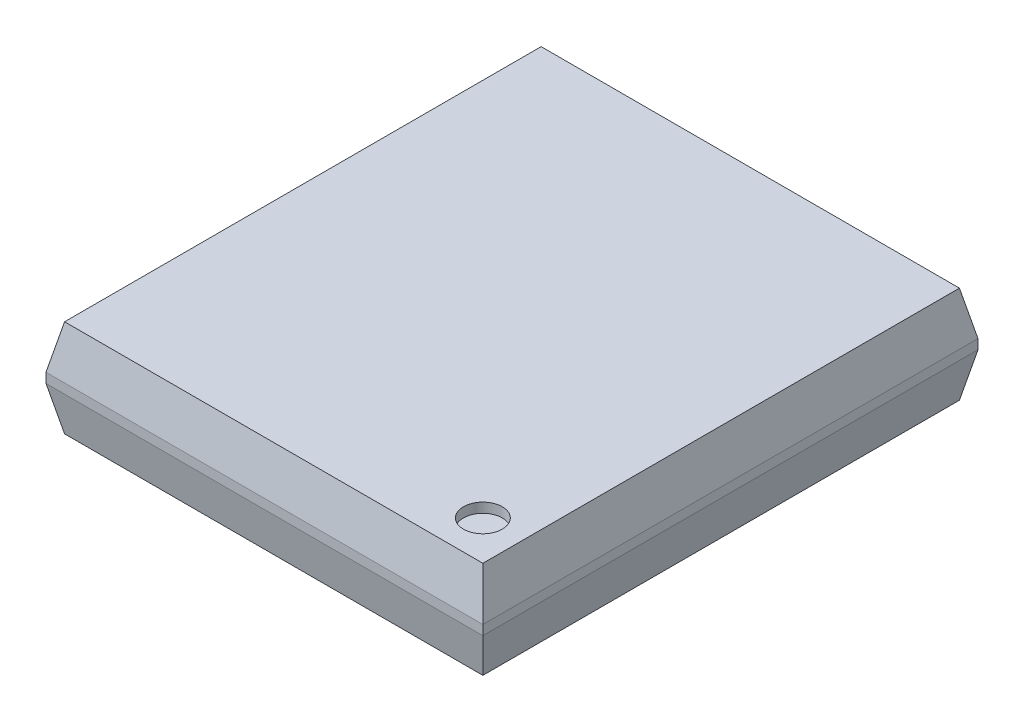
ISO-10303-21;
HEADER;
FILE_DESCRIPTION(('STEP AP214'),'2;1');
FILE_NAME('part.step','',(''),(''),'','','');
FILE_SCHEMA(('AUTOMOTIVE_DESIGN { 1 0 10303 214 1 1 1 1 }'));
ENDSEC;
DATA;
#1=APPLICATION_CONTEXT('core data for automotive mechanical design processes');
#2=APPLICATION_PROTOCOL_DEFINITION('international standard','automotive_design',2000,#1);
#3=PRODUCT_CONTEXT('',#1,'mechanical');
#4=PRODUCT('Part','Part','',(#3));
#5=PRODUCT_RELATED_PRODUCT_CATEGORY('part','',(#4));
#6=PRODUCT_DEFINITION_FORMATION('','',#4);
#7=PRODUCT_DEFINITION_CONTEXT('part definition',#1,'design');
#8=PRODUCT_DEFINITION('design','',#6,#7);
#9=PRODUCT_DEFINITION_SHAPE('','',#8);
#10=(LENGTH_UNIT() NAMED_UNIT(*) SI_UNIT(.MILLI.,.METRE.));
#11=(NAMED_UNIT(*) PLANE_ANGLE_UNIT() SI_UNIT($,.RADIAN.));
#12=(NAMED_UNIT(*) SI_UNIT($,.STERADIAN.) SOLID_ANGLE_UNIT());
#13=UNCERTAINTY_MEASURE_WITH_UNIT(LENGTH_MEASURE(1.E-05),#10,'distance_accuracy_value','');
#14=(GEOMETRIC_REPRESENTATION_CONTEXT(3) GLOBAL_UNCERTAINTY_ASSIGNED_CONTEXT((#13)) GLOBAL_UNIT_ASSIGNED_CONTEXT((#10,
#11,#12)) REPRESENTATION_CONTEXT('',''));
#15=CARTESIAN_POINT('',(0.,0.,0.));
#16=DIRECTION('',(0.,0.,1.));
#17=DIRECTION('',(1.,0.,0.));
#18=AXIS2_PLACEMENT_3D('',#15,#16,#17);
#19=CARTESIAN_POINT('',(1.75,0.4,2.05));
#20=DIRECTION('',(0.,1.,0.));
#21=DIRECTION('',(0.,0.,1.));
#22=AXIS2_PLACEMENT_3D('',#19,#20,#21);
#23=PLANE('',#22);
#24=CARTESIAN_POINT('',(1.75,0.4,2.05));
#25=DIRECTION('',(0.,1.,0.));
#26=DIRECTION('',(0.,0.,1.));
#27=AXIS2_PLACEMENT_3D('',#24,#25,#26);
#28=CIRCLE('',#27,0.2);
#29=CARTESIAN_POINT('',(1.75,0.4,2.25));
#30=VERTEX_POINT('',#29);
#31=EDGE_CURVE('E20',#30,#30,#28,.T.);
#32=ORIENTED_EDGE('',*,*,#31,.T.);
#33=EDGE_LOOP('',(#32));
#34=FACE_BOUND('',#33,.T.);
#35=ADVANCED_FACE('F17',(#34),#23,.T.);
#36=CARTESIAN_POINT('',(1.75,0.4,2.05));
#37=DIRECTION('',(0.,1.,0.));
#38=DIRECTION('',(0.,0.,1.));
#39=AXIS2_PLACEMENT_3D('',#36,#37,#38);
#40=CYLINDRICAL_SURFACE('',#39,0.2);
#41=ORIENTED_EDGE('',*,*,#31,.F.);
#42=EDGE_LOOP('',(#41));
#43=FACE_BOUND('',#42,.T.);
#44=CARTESIAN_POINT('',(1.75,0.5,2.05));
#45=DIRECTION('',(0.,1.,0.));
#46=DIRECTION('',(0.,0.,1.));
#47=AXIS2_PLACEMENT_3D('',#44,#45,#46);
#48=CIRCLE('',#47,0.2);
#49=CARTESIAN_POINT('',(1.75,0.5,2.25));
#50=VERTEX_POINT('',#49);
#51=EDGE_CURVE('E91',#50,#50,#48,.F.);
#52=ORIENTED_EDGE('',*,*,#51,.F.);
#53=EDGE_LOOP('',(#52));
#54=FACE_BOUND('',#53,.T.);
#55=ADVANCED_FACE('F113',(#43,#54),#40,.F.);
#56=CARTESIAN_POINT('',(-2.25,0.5,2.55));
#57=DIRECTION('',(0.,1.,0.));
#58=DIRECTION('',(0.,0.,1.));
#59=AXIS2_PLACEMENT_3D('',#56,#57,#58);
#60=PLANE('',#59);
#61=ORIENTED_EDGE('',*,*,#51,.T.);
#62=EDGE_LOOP('',(#61));
#63=FACE_BOUND('',#62,.T.);
#64=DIRECTION('',(1.,0.,0.));
#65=VECTOR('',#64,1.);
#66=CARTESIAN_POINT('',(-2.25,0.5,-2.454349547248));
#67=LINE('',#66,#65);
#68=CARTESIAN_POINT('',(2.154349547248,0.5,-2.454349547248));
#69=VERTEX_POINT('',#68);
#70=CARTESIAN_POINT('',(-2.154349547248,0.5,-2.454349547248));
#71=VERTEX_POINT('',#70);
#72=EDGE_CURVE('E82',#69,#71,#67,.F.);
#73=ORIENTED_EDGE('',*,*,#72,.T.);
#74=DIRECTION('',(0.,0.,1.));
#75=VECTOR('',#74,1.);
#76=CARTESIAN_POINT('',(-2.154349547248,0.5,2.55));
#77=LINE('',#76,#75);
#78=CARTESIAN_POINT('',(-2.154349547248,0.5,2.454349547248));
#79=VERTEX_POINT('',#78);
#80=EDGE_CURVE('E79',#71,#79,#77,.T.);
#81=ORIENTED_EDGE('',*,*,#80,.T.);
#82=DIRECTION('',(1.,0.,0.));
#83=VECTOR('',#82,1.);
#84=CARTESIAN_POINT('',(-2.25,0.5,2.454349547248));
#85=LINE('',#84,#83);
#86=CARTESIAN_POINT('',(2.154349547248,0.5,2.454349547248));
#87=VERTEX_POINT('',#86);
#88=EDGE_CURVE('E301',#79,#87,#85,.T.);
#89=ORIENTED_EDGE('',*,*,#88,.T.);
#90=DIRECTION('',(0.,0.,1.));
#91=VECTOR('',#90,1.);
#92=CARTESIAN_POINT('',(2.154349547248,0.5,2.55));
#93=LINE('',#92,#91);
#94=EDGE_CURVE('E85',#87,#69,#93,.F.);
#95=ORIENTED_EDGE('',*,*,#94,.T.);
#96=EDGE_LOOP('',(#73,#81,#89,#95));
#97=FACE_BOUND('',#96,.T.);
#98=ADVANCED_FACE('F83',(#63,#97),#60,.T.);
#99=CARTESIAN_POINT('',(-2.25,0.5,-2.454349547248));
#100=DIRECTION('',(0.,-0.20791169081795,0.978147600733765));
#101=DIRECTION('',(0.,-0.978147600733765,-0.20791169081795));
#102=AXIS2_PLACEMENT_3D('',#99,#100,#101);
#103=PLANE('',#102);
#104=DIRECTION('',(0.203558594952925,0.95766789485774,0.203558594953729));
#105=VECTOR('',#104,1.);
#106=CARTESIAN_POINT('',(-2.24999999999962,0.0499999999999094,-2.55));
#107=LINE('',#106,#105);
#108=CARTESIAN_POINT('',(-2.24999999999991,0.0499999999999296,-2.54999999999981));
#109=VERTEX_POINT('',#108);
#110=EDGE_CURVE('E90',#109,#71,#107,.T.);
#111=ORIENTED_EDGE('',*,*,#110,.T.);
#112=ORIENTED_EDGE('',*,*,#72,.F.);
#113=DIRECTION('',(0.203558594952925,-0.95766789485774,-0.203558594953729));
#114=VECTOR('',#113,1.);
#115=CARTESIAN_POINT('',(2.154349547248,0.5,-2.454349547248));
#116=LINE('',#115,#114);
#117=CARTESIAN_POINT('',(2.24999999999995,0.0499999999999397,-2.54999999999981));
#118=VERTEX_POINT('',#117);
#119=EDGE_CURVE('E324',#69,#118,#116,.T.);
#120=ORIENTED_EDGE('',*,*,#119,.T.);
#121=DIRECTION('',(-1.,0.,0.));
#122=VECTOR('',#121,1.);
#123=CARTESIAN_POINT('',(-2.25,0.04999999999999,-2.55));
#124=LINE('',#123,#122);
#125=EDGE_CURVE('E102',#109,#118,#124,.F.);
#126=ORIENTED_EDGE('',*,*,#125,.F.);
#127=EDGE_LOOP('',(#111,#112,#120,#126));
#128=FACE_BOUND('',#127,.T.);
#129=ADVANCED_FACE('F101',(#128),#103,.F.);
#130=CARTESIAN_POINT('',(-2.154349547248,0.5,2.55));
#131=DIRECTION('',(0.978147600733765,-0.20791169081795,0.));
#132=DIRECTION('',(0.20791169081795,0.978147600733765,0.));
#133=AXIS2_PLACEMENT_3D('',#130,#131,#132);
#134=PLANE('',#133);
#135=DIRECTION('',(0.203558594953731,0.957667894857739,-0.203558594952925));
#136=VECTOR('',#135,1.);
#137=CARTESIAN_POINT('',(-2.25,0.0499999999999094,2.54999999999962));
#138=LINE('',#137,#136);
#139=CARTESIAN_POINT('',(-2.24999999999981,0.0499999999999296,2.5499999999999));
#140=VERTEX_POINT('',#139);
#141=EDGE_CURVE('E98',#140,#79,#138,.T.);
#142=ORIENTED_EDGE('',*,*,#141,.T.);
#143=ORIENTED_EDGE('',*,*,#80,.F.);
#144=ORIENTED_EDGE('',*,*,#110,.F.);
#145=DIRECTION('',(0.,0.,1.));
#146=VECTOR('',#145,1.);
#147=CARTESIAN_POINT('',(-2.25,0.04999999999999,-2.55));
#148=LINE('',#147,#146);
#149=EDGE_CURVE('E309',#140,#109,#148,.F.);
#150=ORIENTED_EDGE('',*,*,#149,.F.);
#151=EDGE_LOOP('',(#142,#143,#144,#150));
#152=FACE_BOUND('',#151,.T.);
#153=ADVANCED_FACE('F95',(#152),#134,.F.);
#154=CARTESIAN_POINT('',(-2.25,0.5,2.454349547248));
#155=DIRECTION('',(0.,-0.20791169081795,-0.978147600733765));
#156=DIRECTION('',(0.,0.978147600733765,-0.20791169081795));
#157=AXIS2_PLACEMENT_3D('',#154,#155,#156);
#158=PLANE('',#157);
#159=ORIENTED_EDGE('',*,*,#141,.F.);
#160=DIRECTION('',(1.,0.,0.));
#161=VECTOR('',#160,1.);
#162=CARTESIAN_POINT('',(-2.25,0.04999999999999,2.55));
#163=LINE('',#162,#161);
#164=CARTESIAN_POINT('',(2.24999999999991,0.0499999999999296,2.54999999999981));
#165=VERTEX_POINT('',#164);
#166=EDGE_CURVE('E299',#165,#140,#163,.F.);
#167=ORIENTED_EDGE('',*,*,#166,.F.);
#168=DIRECTION('',(-0.203558594952925,0.957667894857739,-0.20355859495373));
#169=VECTOR('',#168,1.);
#170=CARTESIAN_POINT('',(2.24999999999962,0.0499999999999094,2.55));
#171=LINE('',#170,#169);
#172=EDGE_CURVE('E327',#165,#87,#171,.T.);
#173=ORIENTED_EDGE('',*,*,#172,.T.);
#174=ORIENTED_EDGE('',*,*,#88,.F.);
#175=EDGE_LOOP('',(#159,#167,#173,#174));
#176=FACE_BOUND('',#175,.T.);
#177=ADVANCED_FACE('F164',(#176),#158,.F.);
#178=CARTESIAN_POINT('',(2.154349547248,0.5,2.55));
#179=DIRECTION('',(-0.978147600733765,-0.20791169081795,0.));
#180=DIRECTION('',(0.20791169081795,-0.978147600733765,0.));
#181=AXIS2_PLACEMENT_3D('',#178,#179,#180);
#182=PLANE('',#181);
#183=ORIENTED_EDGE('',*,*,#119,.F.);
#184=ORIENTED_EDGE('',*,*,#94,.F.);
#185=ORIENTED_EDGE('',*,*,#172,.F.);
#186=DIRECTION('',(0.,0.,-1.));
#187=VECTOR('',#186,1.);
#188=CARTESIAN_POINT('',(2.25,0.04999999999999,-2.55));
#189=LINE('',#188,#187);
#190=EDGE_CURVE('E318',#118,#165,#189,.F.);
#191=ORIENTED_EDGE('',*,*,#190,.F.);
#192=EDGE_LOOP('',(#183,#184,#185,#191));
#193=FACE_BOUND('',#192,.T.);
#194=ADVANCED_FACE('F160',(#193),#182,.F.);
#195=CARTESIAN_POINT('',(-2.25,-0.5,-2.55));
#196=DIRECTION('',(0.,0.,-1.));
#197=DIRECTION('',(-1.,0.,0.));
#198=AXIS2_PLACEMENT_3D('',#195,#196,#197);
#199=PLANE('',#198);
#200=DIRECTION('',(0.,1.,0.));
#201=VECTOR('',#200,1.);
#202=CARTESIAN_POINT('',(2.25,-0.5,-2.55));
#203=LINE('',#202,#201);
#204=CARTESIAN_POINT('',(2.25,-0.04999999999999,-2.55));
#205=VERTEX_POINT('',#204);
#206=EDGE_CURVE('E315',#205,#118,#203,.T.);
#207=ORIENTED_EDGE('',*,*,#206,.F.);
#208=DIRECTION('',(1.,0.,0.));
#209=VECTOR('',#208,1.);
#210=CARTESIAN_POINT('',(-2.25,-0.04999999999999,-2.55));
#211=LINE('',#210,#209);
#212=CARTESIAN_POINT('',(-2.25,-0.04999999999999,-2.55));
#213=VERTEX_POINT('',#212);
#214=EDGE_CURVE('E331',#213,#205,#211,.T.);
#215=ORIENTED_EDGE('',*,*,#214,.F.);
#216=DIRECTION('',(0.,1.,0.));
#217=VECTOR('',#216,1.);
#218=CARTESIAN_POINT('',(-2.25,-0.5,-2.55));
#219=LINE('',#218,#217);
#220=EDGE_CURVE('E307',#109,#213,#219,.F.);
#221=ORIENTED_EDGE('',*,*,#220,.F.);
#222=ORIENTED_EDGE('',*,*,#125,.T.);
#223=EDGE_LOOP('',(#207,#215,#221,#222));
#224=FACE_BOUND('',#223,.T.);
#225=ADVANCED_FACE('F156',(#224),#199,.T.);
#226=CARTESIAN_POINT('',(-2.25,-0.5,-2.55));
#227=DIRECTION('',(-1.,0.,0.));
#228=DIRECTION('',(0.,0.,1.));
#229=AXIS2_PLACEMENT_3D('',#226,#227,#228);
#230=PLANE('',#229);
#231=ORIENTED_EDGE('',*,*,#220,.T.);
#232=DIRECTION('',(0.,0.,1.));
#233=VECTOR('',#232,1.);
#234=CARTESIAN_POINT('',(-2.25,-0.04999999999999,-2.55));
#235=LINE('',#234,#233);
#236=CARTESIAN_POINT('',(-2.25,-0.04999999999999,2.55));
#237=VERTEX_POINT('',#236);
#238=EDGE_CURVE('E313',#237,#213,#235,.F.);
#239=ORIENTED_EDGE('',*,*,#238,.F.);
#240=DIRECTION('',(0.,1.,0.));
#241=VECTOR('',#240,1.);
#242=CARTESIAN_POINT('',(-2.25,-0.5,2.55));
#243=LINE('',#242,#241);
#244=EDGE_CURVE('E304',#140,#237,#243,.F.);
#245=ORIENTED_EDGE('',*,*,#244,.F.);
#246=ORIENTED_EDGE('',*,*,#149,.T.);
#247=EDGE_LOOP('',(#231,#239,#245,#246));
#248=FACE_BOUND('',#247,.T.);
#249=ADVANCED_FACE('F152',(#248),#230,.T.);
#250=CARTESIAN_POINT('',(-2.25,-0.5,2.55));
#251=DIRECTION('',(0.,0.,1.));
#252=DIRECTION('',(1.,0.,0.));
#253=AXIS2_PLACEMENT_3D('',#250,#251,#252);
#254=PLANE('',#253);
#255=ORIENTED_EDGE('',*,*,#244,.T.);
#256=DIRECTION('',(1.,0.,0.));
#257=VECTOR('',#256,1.);
#258=CARTESIAN_POINT('',(-2.25,-0.04999999999999,2.55));
#259=LINE('',#258,#257);
#260=CARTESIAN_POINT('',(2.25,-0.04999999999999,2.55));
#261=VERTEX_POINT('',#260);
#262=EDGE_CURVE('E338',#261,#237,#259,.F.);
#263=ORIENTED_EDGE('',*,*,#262,.F.);
#264=DIRECTION('',(0.,1.,0.));
#265=VECTOR('',#264,1.);
#266=CARTESIAN_POINT('',(2.25,-0.5,2.55));
#267=LINE('',#266,#265);
#268=EDGE_CURVE('E306',#165,#261,#267,.F.);
#269=ORIENTED_EDGE('',*,*,#268,.F.);
#270=ORIENTED_EDGE('',*,*,#166,.T.);
#271=EDGE_LOOP('',(#255,#263,#269,#270));
#272=FACE_BOUND('',#271,.T.);
#273=ADVANCED_FACE('F148',(#272),#254,.T.);
#274=CARTESIAN_POINT('',(2.25,-0.5,-2.55));
#275=DIRECTION('',(1.,0.,0.));
#276=DIRECTION('',(0.,0.,-1.));
#277=AXIS2_PLACEMENT_3D('',#274,#275,#276);
#278=PLANE('',#277);
#279=ORIENTED_EDGE('',*,*,#268,.T.);
#280=DIRECTION('',(0.,0.,1.));
#281=VECTOR('',#280,1.);
#282=CARTESIAN_POINT('',(2.25,-0.04999999999999,-2.55));
#283=LINE('',#282,#281);
#284=EDGE_CURVE('E345',#205,#261,#283,.T.);
#285=ORIENTED_EDGE('',*,*,#284,.F.);
#286=ORIENTED_EDGE('',*,*,#206,.T.);
#287=ORIENTED_EDGE('',*,*,#190,.T.);
#288=EDGE_LOOP('',(#279,#285,#286,#287));
#289=FACE_BOUND('',#288,.T.);
#290=ADVANCED_FACE('F144',(#289),#278,.T.);
#291=CARTESIAN_POINT('',(-2.25,-0.04999999999999,-2.55));
#292=DIRECTION('',(0.,-0.20791169081795,-0.978147600733765));
#293=DIRECTION('',(0.,0.978147600733765,-0.20791169081795));
#294=AXIS2_PLACEMENT_3D('',#291,#292,#293);
#295=PLANE('',#294);
#296=DIRECTION('',(0.203558594952925,-0.957667894857739,0.20355859495373));
#297=VECTOR('',#296,1.);
#298=CARTESIAN_POINT('',(-2.25,-0.04999999999999,-2.55));
#299=LINE('',#298,#297);
#300=CARTESIAN_POINT('',(-2.15434954724809,-0.500000000000061,-2.45434954724819));
#301=VERTEX_POINT('',#300);
#302=EDGE_CURVE('E336',#213,#301,#299,.T.);
#303=ORIENTED_EDGE('',*,*,#302,.F.);
#304=ORIENTED_EDGE('',*,*,#214,.T.);
#305=DIRECTION('',(0.203558594952925,0.957667894857739,-0.20355859495373));
#306=VECTOR('',#305,1.);
#307=CARTESIAN_POINT('',(2.15434954724838,-0.500000000000081,-2.454349547248));
#308=LINE('',#307,#306);
#309=CARTESIAN_POINT('',(2.15434954724809,-0.500000000000061,-2.45434954724819));
#310=VERTEX_POINT('',#309);
#311=EDGE_CURVE('E342',#310,#205,#308,.T.);
#312=ORIENTED_EDGE('',*,*,#311,.F.);
#313=DIRECTION('',(1.,0.,0.));
#314=VECTOR('',#313,1.);
#315=CARTESIAN_POINT('',(-2.25,-0.5,-2.454349547248));
#316=LINE('',#315,#314);
#317=EDGE_CURVE('E348',#310,#301,#316,.F.);
#318=ORIENTED_EDGE('',*,*,#317,.T.);
#319=EDGE_LOOP('',(#303,#304,#312,#318));
#320=FACE_BOUND('',#319,.T.);
#321=ADVANCED_FACE('F140',(#320),#295,.T.);
#322=CARTESIAN_POINT('',(-2.25,-0.04999999999999,-2.55));
#323=DIRECTION('',(-0.978147600733765,-0.20791169081795,0.));
#324=DIRECTION('',(0.20791169081795,-0.978147600733765,0.));
#325=AXIS2_PLACEMENT_3D('',#322,#323,#324);
#326=PLANE('',#325);
#327=ORIENTED_EDGE('',*,*,#302,.T.);
#328=DIRECTION('',(0.,0.,1.));
#329=VECTOR('',#328,1.);
#330=CARTESIAN_POINT('',(-2.154349547248,-0.5,2.55));
#331=LINE('',#330,#329);
#332=CARTESIAN_POINT('',(-2.15434954724819,-0.500000000000061,2.45434954724809));
#333=VERTEX_POINT('',#332);
#334=EDGE_CURVE('E351',#301,#333,#331,.T.);
#335=ORIENTED_EDGE('',*,*,#334,.T.);
#336=DIRECTION('',(0.203558594953731,-0.957667894857739,-0.203558594952925));
#337=VECTOR('',#336,1.);
#338=CARTESIAN_POINT('',(-2.25,-0.04999999999999,2.55));
#339=LINE('',#338,#337);
#340=EDGE_CURVE('E340',#237,#333,#339,.T.);
#341=ORIENTED_EDGE('',*,*,#340,.F.);
#342=ORIENTED_EDGE('',*,*,#238,.T.);
#343=EDGE_LOOP('',(#327,#335,#341,#342));
#344=FACE_BOUND('',#343,.T.);
#345=ADVANCED_FACE('F136',(#344),#326,.T.);
#346=CARTESIAN_POINT('',(-2.25,-0.04999999999999,2.55));
#347=DIRECTION('',(0.,-0.20791169081795,0.978147600733765));
#348=DIRECTION('',(0.,-0.978147600733765,-0.20791169081795));
#349=AXIS2_PLACEMENT_3D('',#346,#347,#348);
#350=PLANE('',#349);
#351=ORIENTED_EDGE('',*,*,#340,.T.);
#352=DIRECTION('',(1.,0.,0.));
#353=VECTOR('',#352,1.);
#354=CARTESIAN_POINT('',(-2.25,-0.5,2.454349547248));
#355=LINE('',#354,#353);
#356=CARTESIAN_POINT('',(2.15434954724809,-0.500000000000061,2.45434954724819));
#357=VERTEX_POINT('',#356);
#358=EDGE_CURVE('E26',#333,#357,#355,.T.);
#359=ORIENTED_EDGE('',*,*,#358,.T.);
#360=DIRECTION('',(-0.203558594952925,-0.95766789485774,-0.203558594953729));
#361=VECTOR('',#360,1.);
#362=CARTESIAN_POINT('',(2.25,-0.04999999999999,2.55));
#363=LINE('',#362,#361);
#364=EDGE_CURVE('E34',#261,#357,#363,.T.);
#365=ORIENTED_EDGE('',*,*,#364,.F.);
#366=ORIENTED_EDGE('',*,*,#262,.T.);
#367=EDGE_LOOP('',(#351,#359,#365,#366));
#368=FACE_BOUND('',#367,.T.);
#369=ADVANCED_FACE('F130',(#368),#350,.T.);
#370=CARTESIAN_POINT('',(2.25,-0.04999999999999,-2.55));
#371=DIRECTION('',(0.978147600733765,-0.20791169081795,0.));
#372=DIRECTION('',(0.20791169081795,0.978147600733765,0.));
#373=AXIS2_PLACEMENT_3D('',#370,#371,#372);
#374=PLANE('',#373);
#375=ORIENTED_EDGE('',*,*,#364,.T.);
#376=DIRECTION('',(0.,0.,1.));
#377=VECTOR('',#376,1.);
#378=CARTESIAN_POINT('',(2.154349547248,-0.5,2.55));
#379=LINE('',#378,#377);
#380=EDGE_CURVE('E11',#357,#310,#379,.F.);
#381=ORIENTED_EDGE('',*,*,#380,.T.);
#382=ORIENTED_EDGE('',*,*,#311,.T.);
#383=ORIENTED_EDGE('',*,*,#284,.T.);
#384=EDGE_LOOP('',(#375,#381,#382,#383));
#385=FACE_BOUND('',#384,.T.);
#386=ADVANCED_FACE('F124',(#385),#374,.T.);
#387=CARTESIAN_POINT('',(-2.25,-0.5,2.55));
#388=DIRECTION('',(0.,1.,0.));
#389=DIRECTION('',(0.,0.,1.));
#390=AXIS2_PLACEMENT_3D('',#387,#388,#389);
#391=PLANE('',#390);
#392=ORIENTED_EDGE('',*,*,#358,.F.);
#393=ORIENTED_EDGE('',*,*,#334,.F.);
#394=ORIENTED_EDGE('',*,*,#317,.F.);
#395=ORIENTED_EDGE('',*,*,#380,.F.);
#396=EDGE_LOOP('',(#392,#393,#394,#395));
#397=FACE_BOUND('',#396,.T.);
#398=ADVANCED_FACE('F122',(#397),#391,.F.);
#399=CLOSED_SHELL('',(#35,#55,#98,#129,#153,#177,#194,#225,#249,#273,#290,#321,#345,#369,#386,#398));
#400=MANIFOLD_SOLID_BREP('B1',#399);
#401=ADVANCED_BREP_SHAPE_REPRESENTATION('',(#18,#400),#14);
#402=SHAPE_DEFINITION_REPRESENTATION(#9,#401);
ENDSEC;
END-ISO-10303-21;
